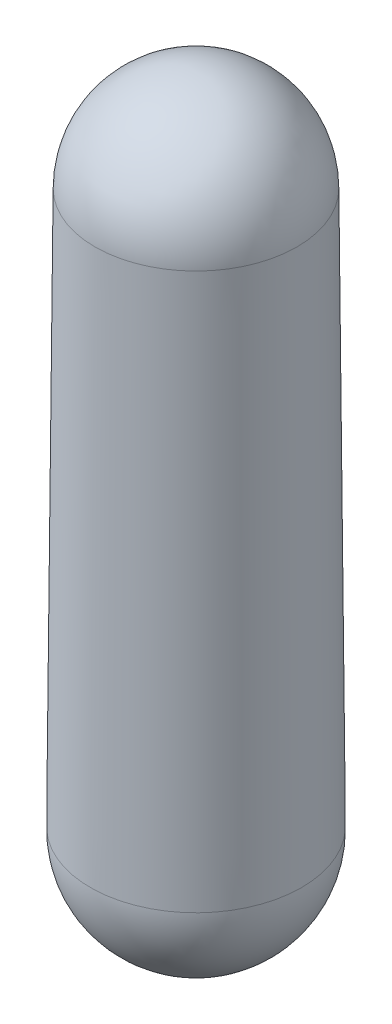
ISO-10303-21;
HEADER;
FILE_DESCRIPTION(('STEP AP214'),'2;1');
FILE_NAME('part.step','',(''),(''),'','','');
FILE_SCHEMA(('AUTOMOTIVE_DESIGN { 1 0 10303 214 1 1 1 1 }'));
ENDSEC;
DATA;
#1=APPLICATION_CONTEXT('core data for automotive mechanical design processes');
#2=APPLICATION_PROTOCOL_DEFINITION('international standard','automotive_design',2000,#1);
#3=PRODUCT_CONTEXT('',#1,'mechanical');
#4=PRODUCT('Part','Part','',(#3));
#5=PRODUCT_RELATED_PRODUCT_CATEGORY('part','',(#4));
#6=PRODUCT_DEFINITION_FORMATION('','',#4);
#7=PRODUCT_DEFINITION_CONTEXT('part definition',#1,'design');
#8=PRODUCT_DEFINITION('design','',#6,#7);
#9=PRODUCT_DEFINITION_SHAPE('','',#8);
#10=(LENGTH_UNIT() NAMED_UNIT(*) SI_UNIT(.MILLI.,.METRE.));
#11=(NAMED_UNIT(*) PLANE_ANGLE_UNIT() SI_UNIT($,.RADIAN.));
#12=(NAMED_UNIT(*) SI_UNIT($,.STERADIAN.) SOLID_ANGLE_UNIT());
#13=UNCERTAINTY_MEASURE_WITH_UNIT(LENGTH_MEASURE(1.E-05),#10,'distance_accuracy_value','');
#14=(GEOMETRIC_REPRESENTATION_CONTEXT(3) GLOBAL_UNCERTAINTY_ASSIGNED_CONTEXT((#13)) GLOBAL_UNIT_ASSIGNED_CONTEXT((#10,
#11,#12)) REPRESENTATION_CONTEXT('',''));
#15=CARTESIAN_POINT('',(0.,0.,0.));
#16=DIRECTION('',(0.,0.,1.));
#17=DIRECTION('',(1.,0.,0.));
#18=AXIS2_PLACEMENT_3D('',#15,#16,#17);
#19=CARTESIAN_POINT('',(0.,-35.6628714884907,0.));
#20=DIRECTION('',(0.,-1.,0.));
#21=DIRECTION('',(0.,0.,-1.));
#22=AXIS2_PLACEMENT_3D('',#19,#20,#21);
#23=CONICAL_SURFACE('',#22,6.8,0.00841191164423434);
#24=CARTESIAN_POINT('',(0.,-35.5484748873493,0.));
#25=DIRECTION('',(0.,-1.,0.));
#26=DIRECTION('',(0.,0.,-1.));
#27=AXIS2_PLACEMENT_3D('',#24,#25,#26);
#28=CIRCLE('',#27,6.79903768320076);
#29=CARTESIAN_POINT('',(0.,-35.5484748873493,-6.79903768320076));
#30=VERTEX_POINT('',#29);
#31=EDGE_CURVE('E10',#30,#30,#28,.T.);
#32=ORIENTED_EDGE('',*,*,#31,.F.);
#33=EDGE_LOOP('',(#32));
#34=FACE_BOUND('',#33,.T.);
#35=CARTESIAN_POINT('',(0.,-5.48950641887647E-10,0.));
#36=DIRECTION('',(0.,1.,0.));
#37=DIRECTION('',(0.,0.,1.));
#38=AXIS2_PLACEMENT_3D('',#35,#36,#37);
#39=CIRCLE('',#38,6.50000000000462);
#40=CARTESIAN_POINT('',(0.,-5.48950641887647E-10,6.50000000000462));
#41=VERTEX_POINT('',#40);
#42=EDGE_CURVE('E34',#41,#41,#39,.T.);
#43=ORIENTED_EDGE('',*,*,#42,.F.);
#44=EDGE_LOOP('',(#43));
#45=FACE_BOUND('',#44,.T.);
#46=ADVANCED_FACE('F31',(#34,#45),#23,.T.);
#47=CARTESIAN_POINT('',(0.,0.,0.));
#48=DIRECTION('',(0.,-1.,0.));
#49=DIRECTION('',(1.,0.,0.));
#50=AXIS2_PLACEMENT_3D('',#47,#48,#49);
#51=SPHERICAL_SURFACE('',#50,6.5);
#52=ORIENTED_EDGE('',*,*,#42,.T.);
#53=EDGE_LOOP('',(#52));
#54=FACE_BOUND('',#53,.T.);
#55=ADVANCED_FACE('F43',(#54),#51,.T.);
#56=CARTESIAN_POINT('',(0.,-35.6628714884907,0.));
#57=DIRECTION('',(0.,-1.,0.));
#58=DIRECTION('',(1.,0.,0.));
#59=AXIS2_PLACEMENT_3D('',#56,#57,#58);
#60=SPHERICAL_SURFACE('',#59,6.8);
#61=ORIENTED_EDGE('',*,*,#31,.T.);
#62=EDGE_LOOP('',(#61));
#63=FACE_BOUND('',#62,.T.);
#64=ADVANCED_FACE('F50',(#63),#60,.T.);
#65=CLOSED_SHELL('',(#46,#55,#64));
#66=MANIFOLD_SOLID_BREP('B2',#65);
#67=ADVANCED_BREP_SHAPE_REPRESENTATION('',(#18,#66),#14);
#68=SHAPE_DEFINITION_REPRESENTATION(#9,#67);
ENDSEC;
END-ISO-10303-21;
